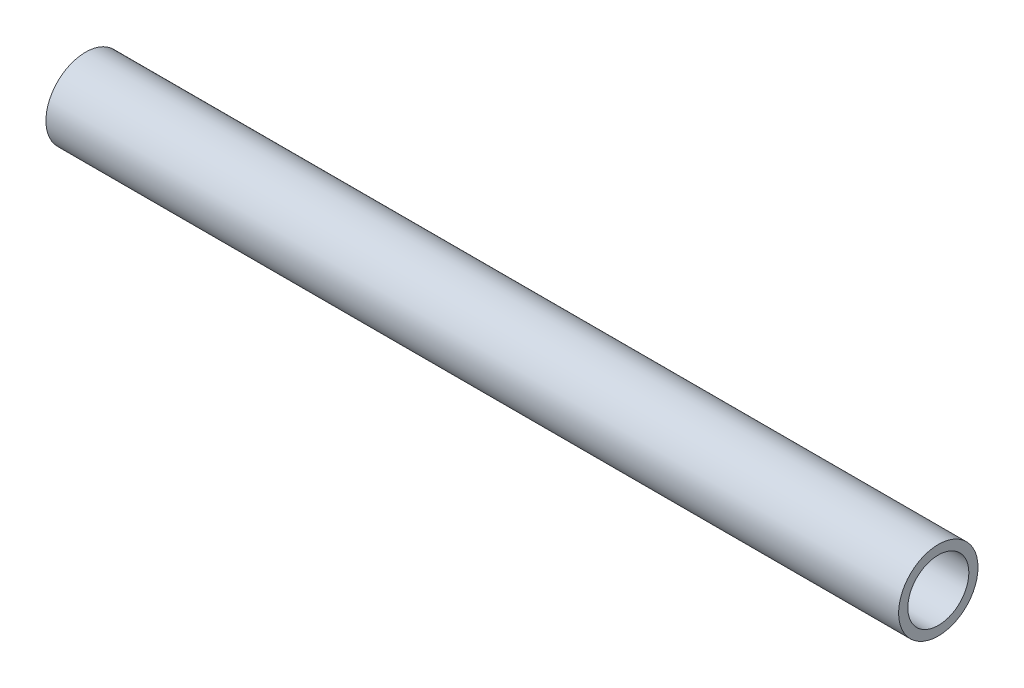
ISO-10303-21;
HEADER;
FILE_DESCRIPTION(('STEP AP214'),'2;1');
FILE_NAME('part.step','',(''),(''),'','','');
FILE_SCHEMA(('AUTOMOTIVE_DESIGN { 1 0 10303 214 1 1 1 1 }'));
ENDSEC;
DATA;
#1=APPLICATION_CONTEXT('core data for automotive mechanical design processes');
#2=APPLICATION_PROTOCOL_DEFINITION('international standard','automotive_design',2000,#1);
#3=PRODUCT_CONTEXT('',#1,'mechanical');
#4=PRODUCT('Part','Part','',(#3));
#5=PRODUCT_RELATED_PRODUCT_CATEGORY('part','',(#4));
#6=PRODUCT_DEFINITION_FORMATION('','',#4);
#7=PRODUCT_DEFINITION_CONTEXT('part definition',#1,'design');
#8=PRODUCT_DEFINITION('design','',#6,#7);
#9=PRODUCT_DEFINITION_SHAPE('','',#8);
#10=(LENGTH_UNIT() NAMED_UNIT(*) SI_UNIT(.MILLI.,.METRE.));
#11=(NAMED_UNIT(*) PLANE_ANGLE_UNIT() SI_UNIT($,.RADIAN.));
#12=(NAMED_UNIT(*) SI_UNIT($,.STERADIAN.) SOLID_ANGLE_UNIT());
#13=UNCERTAINTY_MEASURE_WITH_UNIT(LENGTH_MEASURE(1.E-05),#10,'distance_accuracy_value','');
#14=(GEOMETRIC_REPRESENTATION_CONTEXT(3) GLOBAL_UNCERTAINTY_ASSIGNED_CONTEXT((#13)) GLOBAL_UNIT_ASSIGNED_CONTEXT((#10,
#11,#12)) REPRESENTATION_CONTEXT('',''));
#15=CARTESIAN_POINT('',(0.,0.,0.));
#16=DIRECTION('',(0.,0.,1.));
#17=DIRECTION('',(1.,0.,0.));
#18=AXIS2_PLACEMENT_3D('',#15,#16,#17);
#19=CARTESIAN_POINT('',(139.7,0.,0.));
#20=DIRECTION('',(1.,0.,0.));
#21=DIRECTION('',(0.,0.,-1.));
#22=AXIS2_PLACEMENT_3D('',#19,#20,#21);
#23=PLANE('',#22);
#24=CARTESIAN_POINT('',(139.7,0.,0.));
#25=DIRECTION('',(1.,0.,0.));
#26=DIRECTION('',(0.,0.,-1.));
#27=AXIS2_PLACEMENT_3D('',#24,#25,#26);
#28=CIRCLE('',#27,6.5);
#29=CARTESIAN_POINT('',(139.7,0.,-6.5));
#30=VERTEX_POINT('',#29);
#31=EDGE_CURVE('E10',#30,#30,#28,.T.);
#32=ORIENTED_EDGE('',*,*,#31,.T.);
#33=EDGE_LOOP('',(#32));
#34=FACE_BOUND('',#33,.T.);
#35=CARTESIAN_POINT('',(139.7,0.,0.));
#36=DIRECTION('',(1.,0.,0.));
#37=DIRECTION('',(0.,0.,-1.));
#38=AXIS2_PLACEMENT_3D('',#35,#36,#37);
#39=CIRCLE('',#38,5.);
#40=CARTESIAN_POINT('',(139.7,0.,-5.));
#41=VERTEX_POINT('',#40);
#42=EDGE_CURVE('E56',#41,#41,#39,.T.);
#43=ORIENTED_EDGE('',*,*,#42,.F.);
#44=EDGE_LOOP('',(#43));
#45=FACE_BOUND('',#44,.T.);
#46=ADVANCED_FACE('F43',(#34,#45),#23,.T.);
#47=CARTESIAN_POINT('',(0.,0.,0.));
#48=DIRECTION('',(1.,0.,0.));
#49=DIRECTION('',(0.,0.,-1.));
#50=AXIS2_PLACEMENT_3D('',#47,#48,#49);
#51=PLANE('',#50);
#52=CARTESIAN_POINT('',(0.,0.,0.));
#53=DIRECTION('',(1.,0.,0.));
#54=DIRECTION('',(0.,0.,-1.));
#55=AXIS2_PLACEMENT_3D('',#52,#53,#54);
#56=CIRCLE('',#55,6.5);
#57=CARTESIAN_POINT('',(0.,0.,-6.5));
#58=VERTEX_POINT('',#57);
#59=EDGE_CURVE('E47',#58,#58,#56,.T.);
#60=ORIENTED_EDGE('',*,*,#59,.F.);
#61=EDGE_LOOP('',(#60));
#62=FACE_BOUND('',#61,.T.);
#63=CARTESIAN_POINT('',(0.,0.,0.));
#64=DIRECTION('',(1.,0.,0.));
#65=DIRECTION('',(0.,0.,-1.));
#66=AXIS2_PLACEMENT_3D('',#63,#64,#65);
#67=CIRCLE('',#66,5.);
#68=CARTESIAN_POINT('',(0.,0.,-5.));
#69=VERTEX_POINT('',#68);
#70=EDGE_CURVE('E58',#69,#69,#67,.T.);
#71=ORIENTED_EDGE('',*,*,#70,.T.);
#72=EDGE_LOOP('',(#71));
#73=FACE_BOUND('',#72,.T.);
#74=ADVANCED_FACE('F70',(#62,#73),#51,.F.);
#75=CARTESIAN_POINT('',(139.7,0.,0.));
#76=DIRECTION('',(-1.,0.,0.));
#77=DIRECTION('',(0.,0.,1.));
#78=AXIS2_PLACEMENT_3D('',#75,#76,#77);
#79=CYLINDRICAL_SURFACE('',#78,6.5);
#80=ORIENTED_EDGE('',*,*,#31,.F.);
#81=EDGE_LOOP('',(#80));
#82=FACE_BOUND('',#81,.T.);
#83=ORIENTED_EDGE('',*,*,#59,.T.);
#84=EDGE_LOOP('',(#83));
#85=FACE_BOUND('',#84,.T.);
#86=ADVANCED_FACE('F45',(#82,#85),#79,.T.);
#87=CARTESIAN_POINT('',(139.7,0.,0.));
#88=DIRECTION('',(-1.,0.,0.));
#89=DIRECTION('',(0.,0.,1.));
#90=AXIS2_PLACEMENT_3D('',#87,#88,#89);
#91=CYLINDRICAL_SURFACE('',#90,5.);
#92=ORIENTED_EDGE('',*,*,#42,.T.);
#93=EDGE_LOOP('',(#92));
#94=FACE_BOUND('',#93,.T.);
#95=ORIENTED_EDGE('',*,*,#70,.F.);
#96=EDGE_LOOP('',(#95));
#97=FACE_BOUND('',#96,.T.);
#98=ADVANCED_FACE('F66',(#94,#97),#91,.F.);
#99=CLOSED_SHELL('',(#46,#74,#86,#98));
#100=MANIFOLD_SOLID_BREP('B2',#99);
#101=ADVANCED_BREP_SHAPE_REPRESENTATION('',(#18,#100),#14);
#102=SHAPE_DEFINITION_REPRESENTATION(#9,#101);
ENDSEC;
END-ISO-10303-21;
